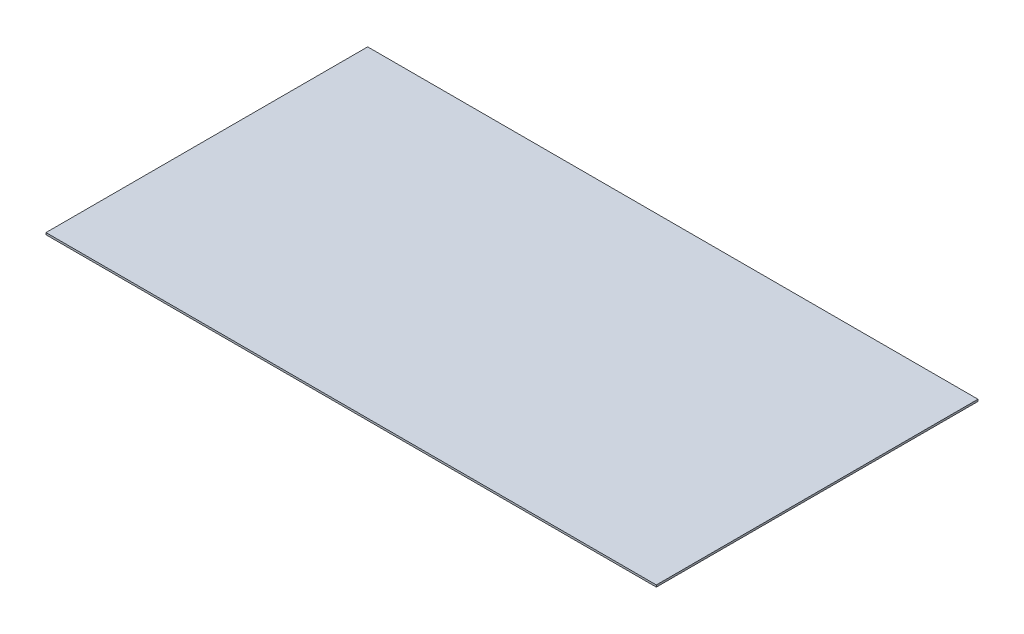
ISO-10303-21;
HEADER;
FILE_DESCRIPTION(('STEP AP214'),'2;1');
FILE_NAME('part.step','',(''),(''),'','','');
FILE_SCHEMA(('AUTOMOTIVE_DESIGN { 1 0 10303 214 1 1 1 1 }'));
ENDSEC;
DATA;
#1=APPLICATION_CONTEXT('core data for automotive mechanical design processes');
#2=APPLICATION_PROTOCOL_DEFINITION('international standard','automotive_design',2000,#1);
#3=PRODUCT_CONTEXT('',#1,'mechanical');
#4=PRODUCT('Part','Part','',(#3));
#5=PRODUCT_RELATED_PRODUCT_CATEGORY('part','',(#4));
#6=PRODUCT_DEFINITION_FORMATION('','',#4);
#7=PRODUCT_DEFINITION_CONTEXT('part definition',#1,'design');
#8=PRODUCT_DEFINITION('design','',#6,#7);
#9=PRODUCT_DEFINITION_SHAPE('','',#8);
#10=(LENGTH_UNIT() NAMED_UNIT(*) SI_UNIT(.MILLI.,.METRE.));
#11=(NAMED_UNIT(*) PLANE_ANGLE_UNIT() SI_UNIT($,.RADIAN.));
#12=(NAMED_UNIT(*) SI_UNIT($,.STERADIAN.) SOLID_ANGLE_UNIT());
#13=UNCERTAINTY_MEASURE_WITH_UNIT(LENGTH_MEASURE(1.E-05),#10,'distance_accuracy_value','');
#14=(GEOMETRIC_REPRESENTATION_CONTEXT(3) GLOBAL_UNCERTAINTY_ASSIGNED_CONTEXT((#13)) GLOBAL_UNIT_ASSIGNED_CONTEXT((#10,
#11,#12)) REPRESENTATION_CONTEXT('',''));
#15=CARTESIAN_POINT('',(0.,0.,0.));
#16=DIRECTION('',(0.,0.,1.));
#17=DIRECTION('',(1.,0.,0.));
#18=AXIS2_PLACEMENT_3D('',#15,#16,#17);
#19=CARTESIAN_POINT('',(187.96,-0.5969,99.06));
#20=DIRECTION('',(-1.,0.,0.));
#21=DIRECTION('',(0.,0.,1.));
#22=AXIS2_PLACEMENT_3D('',#19,#20,#21);
#23=PLANE('',#22);
#24=DIRECTION('',(0.,1.,0.));
#25=VECTOR('',#24,1.);
#26=CARTESIAN_POINT('',(187.96,-0.5969,-99.06));
#27=LINE('',#26,#25);
#28=CARTESIAN_POINT('',(187.96,-0.5969,-99.06));
#29=VERTEX_POINT('',#28);
#30=CARTESIAN_POINT('',(187.96,0.5969,-99.06));
#31=VERTEX_POINT('',#30);
#32=EDGE_CURVE('E99',#29,#31,#27,.T.);
#33=ORIENTED_EDGE('',*,*,#32,.T.);
#34=DIRECTION('',(0.,0.,-1.));
#35=VECTOR('',#34,1.);
#36=CARTESIAN_POINT('',(187.96,0.5969,99.06));
#37=LINE('',#36,#35);
#38=CARTESIAN_POINT('',(187.96,0.5969,99.06));
#39=VERTEX_POINT('',#38);
#40=EDGE_CURVE('E11',#39,#31,#37,.T.);
#41=ORIENTED_EDGE('',*,*,#40,.F.);
#42=DIRECTION('',(0.,1.,0.));
#43=VECTOR('',#42,1.);
#44=CARTESIAN_POINT('',(187.96,-0.5969,99.06));
#45=LINE('',#44,#43);
#46=CARTESIAN_POINT('',(187.96,-0.5969,99.06));
#47=VERTEX_POINT('',#46);
#48=EDGE_CURVE('E87',#47,#39,#45,.T.);
#49=ORIENTED_EDGE('',*,*,#48,.F.);
#50=DIRECTION('',(0.,0.,-1.));
#51=VECTOR('',#50,1.);
#52=CARTESIAN_POINT('',(187.96,-0.5969,99.06));
#53=LINE('',#52,#51);
#54=EDGE_CURVE('E95',#47,#29,#53,.T.);
#55=ORIENTED_EDGE('',*,*,#54,.T.);
#56=EDGE_LOOP('',(#33,#41,#49,#55));
#57=FACE_BOUND('',#56,.T.);
#58=ADVANCED_FACE('F36',(#57),#23,.F.);
#59=CARTESIAN_POINT('',(-187.96,0.5969,99.06));
#60=DIRECTION('',(0.,-1.,0.));
#61=DIRECTION('',(0.,0.,-1.));
#62=AXIS2_PLACEMENT_3D('',#59,#60,#61);
#63=PLANE('',#62);
#64=DIRECTION('',(-1.,0.,0.));
#65=VECTOR('',#64,1.);
#66=CARTESIAN_POINT('',(-187.96,0.5969,-99.06));
#67=LINE('',#66,#65);
#68=CARTESIAN_POINT('',(-187.96,0.5969,-99.06));
#69=VERTEX_POINT('',#68);
#70=EDGE_CURVE('E91',#31,#69,#67,.T.);
#71=ORIENTED_EDGE('',*,*,#70,.T.);
#72=DIRECTION('',(0.,0.,-1.));
#73=VECTOR('',#72,1.);
#74=CARTESIAN_POINT('',(-187.96,0.5969,99.06));
#75=LINE('',#74,#73);
#76=CARTESIAN_POINT('',(-187.96,0.5969,99.06));
#77=VERTEX_POINT('',#76);
#78=EDGE_CURVE('E44',#77,#69,#75,.T.);
#79=ORIENTED_EDGE('',*,*,#78,.F.);
#80=DIRECTION('',(-1.,0.,0.));
#81=VECTOR('',#80,1.);
#82=CARTESIAN_POINT('',(-187.96,0.5969,99.06));
#83=LINE('',#82,#81);
#84=EDGE_CURVE('E82',#39,#77,#83,.T.);
#85=ORIENTED_EDGE('',*,*,#84,.F.);
#86=ORIENTED_EDGE('',*,*,#40,.T.);
#87=EDGE_LOOP('',(#71,#79,#85,#86));
#88=FACE_BOUND('',#87,.T.);
#89=ADVANCED_FACE('F90',(#88),#63,.F.);
#90=CARTESIAN_POINT('',(-187.96,-0.5969,99.06));
#91=DIRECTION('',(1.,0.,0.));
#92=DIRECTION('',(0.,0.,-1.));
#93=AXIS2_PLACEMENT_3D('',#90,#91,#92);
#94=PLANE('',#93);
#95=DIRECTION('',(0.,-1.,0.));
#96=VECTOR('',#95,1.);
#97=CARTESIAN_POINT('',(-187.96,-0.5969,-99.06));
#98=LINE('',#97,#96);
#99=CARTESIAN_POINT('',(-187.96,-0.5969,-99.06));
#100=VERTEX_POINT('',#99);
#101=EDGE_CURVE('E69',#69,#100,#98,.T.);
#102=ORIENTED_EDGE('',*,*,#101,.T.);
#103=DIRECTION('',(0.,0.,-1.));
#104=VECTOR('',#103,1.);
#105=CARTESIAN_POINT('',(-187.96,-0.5969,99.06));
#106=LINE('',#105,#104);
#107=CARTESIAN_POINT('',(-187.96,-0.5969,99.06));
#108=VERTEX_POINT('',#107);
#109=EDGE_CURVE('E92',#108,#100,#106,.T.);
#110=ORIENTED_EDGE('',*,*,#109,.F.);
#111=DIRECTION('',(0.,-1.,0.));
#112=VECTOR('',#111,1.);
#113=CARTESIAN_POINT('',(-187.96,-0.5969,99.06));
#114=LINE('',#113,#112);
#115=EDGE_CURVE('E85',#77,#108,#114,.T.);
#116=ORIENTED_EDGE('',*,*,#115,.F.);
#117=ORIENTED_EDGE('',*,*,#78,.T.);
#118=EDGE_LOOP('',(#102,#110,#116,#117));
#119=FACE_BOUND('',#118,.T.);
#120=ADVANCED_FACE('F93',(#119),#94,.F.);
#121=CARTESIAN_POINT('',(-187.96,-0.5969,99.06));
#122=DIRECTION('',(0.,1.,0.));
#123=DIRECTION('',(0.,0.,1.));
#124=AXIS2_PLACEMENT_3D('',#121,#122,#123);
#125=PLANE('',#124);
#126=DIRECTION('',(1.,0.,0.));
#127=VECTOR('',#126,1.);
#128=CARTESIAN_POINT('',(-187.96,-0.5969,-99.06));
#129=LINE('',#128,#127);
#130=EDGE_CURVE('E75',#100,#29,#129,.T.);
#131=ORIENTED_EDGE('',*,*,#130,.T.);
#132=ORIENTED_EDGE('',*,*,#54,.F.);
#133=DIRECTION('',(1.,0.,0.));
#134=VECTOR('',#133,1.);
#135=CARTESIAN_POINT('',(-187.96,-0.5969,99.06));
#136=LINE('',#135,#134);
#137=EDGE_CURVE('E52',#108,#47,#136,.T.);
#138=ORIENTED_EDGE('',*,*,#137,.F.);
#139=ORIENTED_EDGE('',*,*,#109,.T.);
#140=EDGE_LOOP('',(#131,#132,#138,#139));
#141=FACE_BOUND('',#140,.T.);
#142=ADVANCED_FACE('F106',(#141),#125,.F.);
#143=CARTESIAN_POINT('',(0.,0.,99.06));
#144=DIRECTION('',(0.,0.,-1.));
#145=DIRECTION('',(-1.,0.,0.));
#146=AXIS2_PLACEMENT_3D('',#143,#144,#145);
#147=PLANE('',#146);
#148=ORIENTED_EDGE('',*,*,#48,.T.);
#149=ORIENTED_EDGE('',*,*,#84,.T.);
#150=ORIENTED_EDGE('',*,*,#115,.T.);
#151=ORIENTED_EDGE('',*,*,#137,.T.);
#152=EDGE_LOOP('',(#148,#149,#150,#151));
#153=FACE_BOUND('',#152,.T.);
#154=ADVANCED_FACE('F83',(#153),#147,.F.);
#155=CARTESIAN_POINT('',(0.,0.,-99.06));
#156=DIRECTION('',(0.,0.,-1.));
#157=DIRECTION('',(-1.,0.,0.));
#158=AXIS2_PLACEMENT_3D('',#155,#156,#157);
#159=PLANE('',#158);
#160=ORIENTED_EDGE('',*,*,#32,.F.);
#161=ORIENTED_EDGE('',*,*,#130,.F.);
#162=ORIENTED_EDGE('',*,*,#101,.F.);
#163=ORIENTED_EDGE('',*,*,#70,.F.);
#164=EDGE_LOOP('',(#160,#161,#162,#163));
#165=FACE_BOUND('',#164,.T.);
#166=ADVANCED_FACE('F109',(#165),#159,.T.);
#167=CLOSED_SHELL('',(#58,#89,#120,#142,#154,#166));
#168=MANIFOLD_SOLID_BREP('B2',#167);
#169=ADVANCED_BREP_SHAPE_REPRESENTATION('',(#18,#168),#14);
#170=SHAPE_DEFINITION_REPRESENTATION(#9,#169);
ENDSEC;
END-ISO-10303-21;
